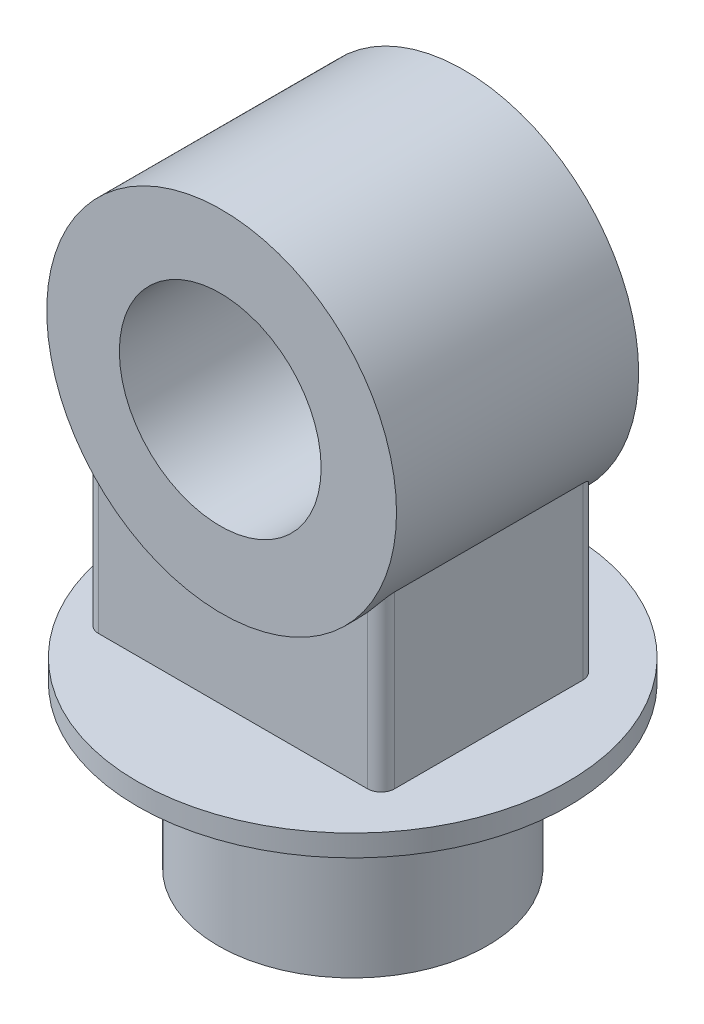
ISO-10303-21;
HEADER;
FILE_DESCRIPTION(('STEP AP214'),'2;1');
FILE_NAME('part.step','',(''),(''),'','','');
FILE_SCHEMA(('AUTOMOTIVE_DESIGN { 1 0 10303 214 1 1 1 1 }'));
ENDSEC;
DATA;
#1=APPLICATION_CONTEXT('core data for automotive mechanical design processes');
#2=APPLICATION_PROTOCOL_DEFINITION('international standard','automotive_design',2000,#1);
#3=PRODUCT_CONTEXT('',#1,'mechanical');
#4=PRODUCT('Part','Part','',(#3));
#5=PRODUCT_RELATED_PRODUCT_CATEGORY('part','',(#4));
#6=PRODUCT_DEFINITION_FORMATION('','',#4);
#7=PRODUCT_DEFINITION_CONTEXT('part definition',#1,'design');
#8=PRODUCT_DEFINITION('design','',#6,#7);
#9=PRODUCT_DEFINITION_SHAPE('','',#8);
#10=(LENGTH_UNIT() NAMED_UNIT(*) SI_UNIT(.MILLI.,.METRE.));
#11=(NAMED_UNIT(*) PLANE_ANGLE_UNIT() SI_UNIT($,.RADIAN.));
#12=(NAMED_UNIT(*) SI_UNIT($,.STERADIAN.) SOLID_ANGLE_UNIT());
#13=UNCERTAINTY_MEASURE_WITH_UNIT(LENGTH_MEASURE(1.E-05),#10,'distance_accuracy_value','');
#14=(GEOMETRIC_REPRESENTATION_CONTEXT(3) GLOBAL_UNCERTAINTY_ASSIGNED_CONTEXT((#13)) GLOBAL_UNIT_ASSIGNED_CONTEXT((#10,
#11,#12)) REPRESENTATION_CONTEXT('',''));
#15=CARTESIAN_POINT('',(0.,0.,0.));
#16=DIRECTION('',(0.,0.,1.));
#17=DIRECTION('',(1.,0.,0.));
#18=AXIS2_PLACEMENT_3D('',#15,#16,#17);
#19=CARTESIAN_POINT('',(0.26168324346057,120.,-0.0361809846551459));
#20=DIRECTION('',(0.,-1.,0.));
#21=DIRECTION('',(0.,0.,-1.));
#22=AXIS2_PLACEMENT_3D('',#19,#20,#21);
#23=CYLINDRICAL_SURFACE('',#22,100.);
#24=CARTESIAN_POINT('',(0.26168324346057,120.,-0.0361809846551459));
#25=DIRECTION('',(0.,1.,0.));
#26=DIRECTION('',(0.,0.,1.));
#27=AXIS2_PLACEMENT_3D('',#24,#25,#26);
#28=CIRCLE('',#27,100.);
#29=CARTESIAN_POINT('',(0.26168324346057,120.,99.9638190153449));
#30=VERTEX_POINT('',#29);
#31=EDGE_CURVE('E140',#30,#30,#28,.T.);
#32=ORIENTED_EDGE('',*,*,#31,.F.);
#33=EDGE_LOOP('',(#32));
#34=FACE_BOUND('',#33,.T.);
#35=CARTESIAN_POINT('',(0.26168324346057,0.,-0.0361809846551459));
#36=DIRECTION('',(0.,1.,0.));
#37=DIRECTION('',(0.,0.,1.));
#38=AXIS2_PLACEMENT_3D('',#35,#36,#37);
#39=CIRCLE('',#38,100.);
#40=CARTESIAN_POINT('',(0.26168324346057,0.,99.9638190153449));
#41=VERTEX_POINT('',#40);
#42=EDGE_CURVE('E209',#41,#41,#39,.T.);
#43=ORIENTED_EDGE('',*,*,#42,.T.);
#44=EDGE_LOOP('',(#43));
#45=FACE_BOUND('',#44,.T.);
#46=ADVANCED_FACE('F39',(#34,#45),#23,.T.);
#47=CARTESIAN_POINT('',(0.26168324346057,0.,-0.0361809846551459));
#48=DIRECTION('',(0.,1.,0.));
#49=DIRECTION('',(0.,0.,1.));
#50=AXIS2_PLACEMENT_3D('',#47,#48,#49);
#51=PLANE('',#50);
#52=ORIENTED_EDGE('',*,*,#42,.F.);
#53=EDGE_LOOP('',(#52));
#54=FACE_BOUND('',#53,.T.);
#55=ADVANCED_FACE('F217',(#54),#51,.F.);
#56=CARTESIAN_POINT('',(0.527861333238733,136.,0.229997105122626));
#57=DIRECTION('',(0.,-1.,0.));
#58=DIRECTION('',(0.,0.,-1.));
#59=AXIS2_PLACEMENT_3D('',#56,#57,#58);
#60=CYLINDRICAL_SURFACE('',#59,160.);
#61=CARTESIAN_POINT('',(0.527861333238733,136.,0.229997105122626));
#62=DIRECTION('',(0.,1.,0.));
#63=DIRECTION('',(0.,0.,1.));
#64=AXIS2_PLACEMENT_3D('',#61,#62,#63);
#65=CIRCLE('',#64,160.);
#66=CARTESIAN_POINT('',(0.527861333238733,136.,160.229997105123));
#67=VERTEX_POINT('',#66);
#68=EDGE_CURVE('E206',#67,#67,#65,.T.);
#69=ORIENTED_EDGE('',*,*,#68,.F.);
#70=EDGE_LOOP('',(#69));
#71=FACE_BOUND('',#70,.T.);
#72=CARTESIAN_POINT('',(0.527861333238733,120.,0.229997105122626));
#73=DIRECTION('',(0.,1.,0.));
#74=DIRECTION('',(0.,0.,1.));
#75=AXIS2_PLACEMENT_3D('',#72,#73,#74);
#76=CIRCLE('',#75,160.);
#77=CARTESIAN_POINT('',(0.527861333238733,120.,160.229997105123));
#78=VERTEX_POINT('',#77);
#79=EDGE_CURVE('E202',#78,#78,#76,.T.);
#80=ORIENTED_EDGE('',*,*,#79,.T.);
#81=EDGE_LOOP('',(#80));
#82=FACE_BOUND('',#81,.T.);
#83=ADVANCED_FACE('F219',(#71,#82),#60,.T.);
#84=CARTESIAN_POINT('',(0.527861333238733,136.,0.229997105122626));
#85=DIRECTION('',(0.,1.,0.));
#86=DIRECTION('',(0.,0.,1.));
#87=AXIS2_PLACEMENT_3D('',#84,#85,#86);
#88=PLANE('',#87);
#89=DIRECTION('',(0.,0.,1.));
#90=VECTOR('',#89,1.);
#91=CARTESIAN_POINT('',(-119.267492370599,136.,79.3782272178331));
#92=LINE('',#91,#90);
#93=CARTESIAN_POINT('',(-119.267492370599,136.,-70.6217727821669));
#94=VERTEX_POINT('',#93);
#95=CARTESIAN_POINT('',(-119.267492370599,136.,69.3782272178331));
#96=VERTEX_POINT('',#95);
#97=EDGE_CURVE('E367',#94,#96,#92,.T.);
#98=ORIENTED_EDGE('',*,*,#97,.F.);
#99=CARTESIAN_POINT('',(-109.267492370599,136.,-70.6217727821669));
#100=DIRECTION('',(0.,1.,0.));
#101=DIRECTION('',(0.,0.,1.));
#102=AXIS2_PLACEMENT_3D('',#99,#100,#101);
#103=CIRCLE('',#102,10.);
#104=CARTESIAN_POINT('',(-109.267492370599,136.,-80.6217727821669));
#105=VERTEX_POINT('',#104);
#106=EDGE_CURVE('E122',#94,#105,#103,.F.);
#107=ORIENTED_EDGE('',*,*,#106,.T.);
#108=DIRECTION('',(-1.,0.,0.));
#109=VECTOR('',#108,1.);
#110=CARTESIAN_POINT('',(100.732507629401,136.,-80.6217727821669));
#111=LINE('',#110,#109);
#112=CARTESIAN_POINT('',(90.7325076294013,136.,-80.6217727821669));
#113=VERTEX_POINT('',#112);
#114=EDGE_CURVE('E364',#113,#105,#111,.T.);
#115=ORIENTED_EDGE('',*,*,#114,.F.);
#116=CARTESIAN_POINT('',(90.7325076294013,136.,-70.6217727821669));
#117=DIRECTION('',(0.,1.,0.));
#118=DIRECTION('',(0.,0.,1.));
#119=AXIS2_PLACEMENT_3D('',#116,#117,#118);
#120=CIRCLE('',#119,10.);
#121=CARTESIAN_POINT('',(100.732507629401,136.,-70.621772782167));
#122=VERTEX_POINT('',#121);
#123=EDGE_CURVE('E60',#113,#122,#120,.F.);
#124=ORIENTED_EDGE('',*,*,#123,.T.);
#125=DIRECTION('',(0.,0.,-1.));
#126=VECTOR('',#125,1.);
#127=CARTESIAN_POINT('',(100.732507629401,136.,79.3782272178331));
#128=LINE('',#127,#126);
#129=CARTESIAN_POINT('',(100.732507629401,136.,69.3782272178331));
#130=VERTEX_POINT('',#129);
#131=EDGE_CURVE('E192',#130,#122,#128,.T.);
#132=ORIENTED_EDGE('',*,*,#131,.F.);
#133=CARTESIAN_POINT('',(90.7325076294013,136.,69.3782272178331));
#134=DIRECTION('',(0.,1.,0.));
#135=DIRECTION('',(0.,0.,1.));
#136=AXIS2_PLACEMENT_3D('',#133,#134,#135);
#137=CIRCLE('',#136,10.);
#138=CARTESIAN_POINT('',(90.7325076294013,136.,79.3782272178331));
#139=VERTEX_POINT('',#138);
#140=EDGE_CURVE('E53',#130,#139,#137,.F.);
#141=ORIENTED_EDGE('',*,*,#140,.T.);
#142=DIRECTION('',(1.,0.,0.));
#143=VECTOR('',#142,1.);
#144=CARTESIAN_POINT('',(100.732507629401,136.,79.3782272178331));
#145=LINE('',#144,#143);
#146=CARTESIAN_POINT('',(-109.267492370599,136.,79.3782272178331));
#147=VERTEX_POINT('',#146);
#148=EDGE_CURVE('E191',#147,#139,#145,.T.);
#149=ORIENTED_EDGE('',*,*,#148,.F.);
#150=CARTESIAN_POINT('',(-109.267492370599,136.,69.3782272178331));
#151=DIRECTION('',(0.,1.,0.));
#152=DIRECTION('',(0.,0.,1.));
#153=AXIS2_PLACEMENT_3D('',#150,#151,#152);
#154=CIRCLE('',#153,10.);
#155=EDGE_CURVE('E123',#147,#96,#154,.F.);
#156=ORIENTED_EDGE('',*,*,#155,.T.);
#157=EDGE_LOOP('',(#98,#107,#115,#124,#132,#141,#149,#156));
#158=FACE_BOUND('',#157,.T.);
#159=ORIENTED_EDGE('',*,*,#68,.T.);
#160=EDGE_LOOP('',(#159));
#161=FACE_BOUND('',#160,.T.);
#162=ADVANCED_FACE('F189',(#158,#161),#88,.T.);
#163=CARTESIAN_POINT('',(0.527861333238733,120.,0.229997105122626));
#164=DIRECTION('',(0.,1.,0.));
#165=DIRECTION('',(0.,0.,1.));
#166=AXIS2_PLACEMENT_3D('',#163,#164,#165);
#167=PLANE('',#166);
#168=ORIENTED_EDGE('',*,*,#31,.T.);
#169=EDGE_LOOP('',(#168));
#170=FACE_BOUND('',#169,.T.);
#171=ORIENTED_EDGE('',*,*,#79,.F.);
#172=EDGE_LOOP('',(#171));
#173=FACE_BOUND('',#172,.T.);
#174=ADVANCED_FACE('F228',(#170,#173),#167,.F.);
#175=CARTESIAN_POINT('',(100.732507629401,465.231832198542,79.3782272178331));
#176=DIRECTION('',(0.,0.,-1.));
#177=DIRECTION('',(-1.,0.,0.));
#178=AXIS2_PLACEMENT_3D('',#175,#176,#177);
#179=PLANE('',#178);
#180=CARTESIAN_POINT('',(-7.1625712417821,335.229832198542,79.3782272178331));
#181=DIRECTION('',(0.,0.,-1.));
#182=DIRECTION('',(-1.,0.,0.));
#183=AXIS2_PLACEMENT_3D('',#180,#181,#182);
#184=CIRCLE('',#183,130.);
#185=CARTESIAN_POINT('',(-109.267492370599,254.765025722181,79.3782272178331));
#186=VERTEX_POINT('',#185);
#187=CARTESIAN_POINT('',(90.7325076294013,249.692977376747,79.3782272178331));
#188=VERTEX_POINT('',#187);
#189=EDGE_CURVE('E115',#186,#188,#184,.F.);
#190=ORIENTED_EDGE('',*,*,#189,.F.);
#191=DIRECTION('',(0.,-1.,0.));
#192=VECTOR('',#191,1.);
#193=CARTESIAN_POINT('',(-109.267492370599,465.231832198542,79.3782272178331));
#194=LINE('',#193,#192);
#195=EDGE_CURVE('E129',#186,#147,#194,.T.);
#196=ORIENTED_EDGE('',*,*,#195,.T.);
#197=ORIENTED_EDGE('',*,*,#148,.T.);
#198=DIRECTION('',(0.,-1.,0.));
#199=VECTOR('',#198,1.);
#200=CARTESIAN_POINT('',(90.7325076294013,465.231832198542,79.3782272178331));
#201=LINE('',#200,#199);
#202=EDGE_CURVE('E131',#139,#188,#201,.F.);
#203=ORIENTED_EDGE('',*,*,#202,.T.);
#204=EDGE_LOOP('',(#190,#196,#197,#203));
#205=FACE_BOUND('',#204,.T.);
#206=ADVANCED_FACE('F127',(#205),#179,.F.);
#207=CARTESIAN_POINT('',(-119.267492370599,465.231832198542,79.3782272178331));
#208=DIRECTION('',(1.,0.,0.));
#209=DIRECTION('',(0.,0.,-1.));
#210=AXIS2_PLACEMENT_3D('',#207,#208,#209);
#211=PLANE('',#210);
#212=ORIENTED_EDGE('',*,*,#97,.T.);
#213=DIRECTION('',(0.,-1.,0.));
#214=VECTOR('',#213,1.);
#215=CARTESIAN_POINT('',(-119.267492370599,465.231832198542,69.3782272178331));
#216=LINE('',#215,#214);
#217=CARTESIAN_POINT('',(-119.267492370599,269.408204607743,69.3782272178331));
#218=VERTEX_POINT('',#217);
#219=EDGE_CURVE('E138',#96,#218,#216,.F.);
#220=ORIENTED_EDGE('',*,*,#219,.T.);
#221=DIRECTION('',(0.,0.,-1.));
#222=VECTOR('',#221,1.);
#223=CARTESIAN_POINT('',(-119.267492370599,269.408204607743,90.));
#224=LINE('',#223,#222);
#225=CARTESIAN_POINT('',(-119.267492370599,269.408204607743,-70.6217727821669));
#226=VERTEX_POINT('',#225);
#227=EDGE_CURVE('E118',#226,#218,#224,.F.);
#228=ORIENTED_EDGE('',*,*,#227,.F.);
#229=DIRECTION('',(0.,-1.,0.));
#230=VECTOR('',#229,1.);
#231=CARTESIAN_POINT('',(-119.267492370599,465.231832198542,-70.6217727821669));
#232=LINE('',#231,#230);
#233=EDGE_CURVE('E135',#226,#94,#232,.T.);
#234=ORIENTED_EDGE('',*,*,#233,.T.);
#235=EDGE_LOOP('',(#212,#220,#228,#234));
#236=FACE_BOUND('',#235,.T.);
#237=ADVANCED_FACE('F234',(#236),#211,.F.);
#238=CARTESIAN_POINT('',(100.732507629401,465.231832198542,79.3782272178331));
#239=DIRECTION('',(-1.,0.,0.));
#240=DIRECTION('',(0.,0.,1.));
#241=AXIS2_PLACEMENT_3D('',#238,#239,#240);
#242=PLANE('',#241);
#243=ORIENTED_EDGE('',*,*,#131,.T.);
#244=DIRECTION('',(0.,-1.,0.));
#245=VECTOR('',#244,1.);
#246=CARTESIAN_POINT('',(100.732507629401,465.231832198542,-70.621772782167));
#247=LINE('',#246,#245);
#248=CARTESIAN_POINT('',(100.732507629401,262.713268881041,-70.6217727821669));
#249=VERTEX_POINT('',#248);
#250=EDGE_CURVE('E152',#122,#249,#247,.F.);
#251=ORIENTED_EDGE('',*,*,#250,.T.);
#252=DIRECTION('',(0.,0.,-1.));
#253=VECTOR('',#252,1.);
#254=CARTESIAN_POINT('',(100.732507629401,262.713268881041,90.));
#255=LINE('',#254,#253);
#256=CARTESIAN_POINT('',(100.732507629401,262.713268881041,69.3782272178331));
#257=VERTEX_POINT('',#256);
#258=EDGE_CURVE('E132',#257,#249,#255,.T.);
#259=ORIENTED_EDGE('',*,*,#258,.F.);
#260=DIRECTION('',(0.,-1.,0.));
#261=VECTOR('',#260,1.);
#262=CARTESIAN_POINT('',(100.732507629401,465.231832198542,69.3782272178331));
#263=LINE('',#262,#261);
#264=EDGE_CURVE('E150',#257,#130,#263,.T.);
#265=ORIENTED_EDGE('',*,*,#264,.T.);
#266=EDGE_LOOP('',(#243,#251,#259,#265));
#267=FACE_BOUND('',#266,.T.);
#268=ADVANCED_FACE('F198',(#267),#242,.F.);
#269=CARTESIAN_POINT('',(100.732507629401,465.231832198542,-80.6217727821669));
#270=DIRECTION('',(0.,0.,1.));
#271=DIRECTION('',(1.,0.,0.));
#272=AXIS2_PLACEMENT_3D('',#269,#270,#271);
#273=PLANE('',#272);
#274=ORIENTED_EDGE('',*,*,#114,.T.);
#275=DIRECTION('',(0.,-1.,0.));
#276=VECTOR('',#275,1.);
#277=CARTESIAN_POINT('',(-109.267492370599,465.231832198542,-80.6217727821669));
#278=LINE('',#277,#276);
#279=CARTESIAN_POINT('',(-109.267492370599,254.765025722181,-80.621772782167));
#280=VERTEX_POINT('',#279);
#281=EDGE_CURVE('E148',#105,#280,#278,.F.);
#282=ORIENTED_EDGE('',*,*,#281,.T.);
#283=CARTESIAN_POINT('',(-7.1625712417821,335.229832198542,-80.621772782167));
#284=DIRECTION('',(0.,0.,1.));
#285=DIRECTION('',(1.,0.,0.));
#286=AXIS2_PLACEMENT_3D('',#283,#284,#285);
#287=CIRCLE('',#286,130.);
#288=CARTESIAN_POINT('',(90.7325076294013,249.692977376747,-80.621772782167));
#289=VERTEX_POINT('',#288);
#290=EDGE_CURVE('E200',#289,#280,#287,.F.);
#291=ORIENTED_EDGE('',*,*,#290,.F.);
#292=DIRECTION('',(0.,-1.,0.));
#293=VECTOR('',#292,1.);
#294=CARTESIAN_POINT('',(90.7325076294013,465.231832198542,-80.6217727821669));
#295=LINE('',#294,#293);
#296=EDGE_CURVE('E145',#289,#113,#295,.T.);
#297=ORIENTED_EDGE('',*,*,#296,.T.);
#298=EDGE_LOOP('',(#274,#282,#291,#297));
#299=FACE_BOUND('',#298,.T.);
#300=ADVANCED_FACE('F238',(#299),#273,.F.);
#301=CARTESIAN_POINT('',(-7.1625712417821,335.229832198542,90.));
#302=DIRECTION('',(0.,0.,-1.));
#303=DIRECTION('',(-1.,0.,0.));
#304=AXIS2_PLACEMENT_3D('',#301,#302,#303);
#305=CYLINDRICAL_SURFACE('',#304,130.);
#306=CARTESIAN_POINT('',(-7.1625712417821,335.229832198542,90.));
#307=DIRECTION('',(0.,0.,1.));
#308=DIRECTION('',(1.,0.,0.));
#309=AXIS2_PLACEMENT_3D('',#306,#307,#308);
#310=CIRCLE('',#309,130.);
#311=CARTESIAN_POINT('',(122.837428758218,335.229832198542,90.));
#312=VERTEX_POINT('',#311);
#313=EDGE_CURVE('E368',#312,#312,#310,.T.);
#314=ORIENTED_EDGE('',*,*,#313,.F.);
#315=EDGE_LOOP('',(#314));
#316=FACE_BOUND('',#315,.T.);
#317=CARTESIAN_POINT('',(-7.1625712417821,335.229832198542,-90.));
#318=DIRECTION('',(0.,0.,1.));
#319=DIRECTION('',(1.,0.,0.));
#320=AXIS2_PLACEMENT_3D('',#317,#318,#319);
#321=CIRCLE('',#320,130.);
#322=CARTESIAN_POINT('',(122.837428758218,335.229832198542,-90.));
#323=VERTEX_POINT('',#322);
#324=EDGE_CURVE('E372',#323,#323,#321,.T.);
#325=ORIENTED_EDGE('',*,*,#324,.T.);
#326=EDGE_LOOP('',(#325));
#327=FACE_BOUND('',#326,.T.);
#328=ORIENTED_EDGE('',*,*,#290,.T.);
#329=CARTESIAN_POINT('',(-109.267492370599,254.765025722181,-80.6217727821669));
#330=CARTESIAN_POINT('',(-109.498900262658,255.058661877432,-80.6217521814497));
#331=CARTESIAN_POINT('',(-109.72902458813,255.353287244784,-80.6137401489048));
#332=CARTESIAN_POINT('',(-110.186313292142,255.943970922768,-80.5821141841533));
#333=CARTESIAN_POINT('',(-110.4134778348,256.240029152692,-80.5585011208002));
#334=CARTESIAN_POINT('',(-110.864713779298,256.833373277592,-80.496021603986));
#335=CARTESIAN_POINT('',(-111.088781730568,257.130660127061,-80.4571393637083));
#336=CARTESIAN_POINT('',(-111.533247033557,257.725639377669,-80.3643547947934));
#337=CARTESIAN_POINT('',(-111.753644328744,258.023331784978,-80.3104522350443));
#338=CARTESIAN_POINT('',(-112.192511752985,258.62140918003,-80.1871637916155));
#339=CARTESIAN_POINT('',(-112.410943702643,258.921792890014,-80.117635727267));
#340=CARTESIAN_POINT('',(-112.843391956407,259.521834634841,-79.9633810910099));
#341=CARTESIAN_POINT('',(-113.057408295637,259.821492675439,-79.878654640049));
#342=CARTESIAN_POINT('',(-113.480561872224,260.419278880946,-79.6938904679674));
#343=CARTESIAN_POINT('',(-113.689701705152,260.717407790638,-79.5938611167531));
#344=CARTESIAN_POINT('',(-114.102811487661,261.311526491415,-79.3781408657023));
#345=CARTESIAN_POINT('',(-114.30678199632,261.607516511332,-79.2624516681859));
#346=CARTESIAN_POINT('',(-114.740103029541,262.24186081388,-78.9958310812714));
#347=CARTESIAN_POINT('',(-114.968529376617,262.579725572788,-78.8422160325002));
#348=CARTESIAN_POINT('',(-115.417104182929,263.249844459353,-78.5122613048293));
#349=CARTESIAN_POINT('',(-115.637252789727,263.582098686967,-78.3359220312684));
#350=CARTESIAN_POINT('',(-116.067732299176,264.238146089981,-77.9592377685597));
#351=CARTESIAN_POINT('',(-116.278082364242,264.561955183419,-77.7589426248545));
#352=CARTESIAN_POINT('',(-116.687899434408,265.198798827694,-77.3318526292036));
#353=CARTESIAN_POINT('',(-116.887370209693,265.511837097066,-77.105067044143));
#354=CARTESIAN_POINT('',(-117.206169956856,266.016668059678,-76.706014709377));
#355=CARTESIAN_POINT('',(-117.329254836846,266.212782340656,-76.5421990610846));
#356=CARTESIAN_POINT('',(-117.56905074812,266.59703745268,-76.2009869744488));
#357=CARTESIAN_POINT('',(-117.685761372287,266.785177774264,-76.0235896703913));
#358=CARTESIAN_POINT('',(-117.911555443021,267.151137460297,-75.6543616866332));
#359=CARTESIAN_POINT('',(-118.020648002503,267.328969111396,-75.4625488421726));
#360=CARTESIAN_POINT('',(-118.229888946827,267.671774238454,-75.0631952756151));
#361=CARTESIAN_POINT('',(-118.330041166431,267.836753223377,-74.8556613680201));
#362=CARTESIAN_POINT('',(-118.488014164341,268.098164812731,-74.4956263309128));
#363=CARTESIAN_POINT('',(-118.548843791065,268.199159974093,-74.3477501158961));
#364=CARTESIAN_POINT('',(-118.664981339939,268.392527865164,-74.0442863166774));
#365=CARTESIAN_POINT('',(-118.720288023244,268.484898660051,-73.8886970140222));
#366=CARTESIAN_POINT('',(-118.824502138679,268.659391941122,-73.5699348637338));
#367=CARTESIAN_POINT('',(-118.873414001331,268.741521520882,-73.4067673738561));
#368=CARTESIAN_POINT('',(-118.963933052619,268.893843863989,-73.0730754687763));
#369=CARTESIAN_POINT('',(-119.005545014664,268.964044426779,-72.9025559526443));
#370=CARTESIAN_POINT('',(-119.073279101215,269.078513238376,-72.5882848746702));
#371=CARTESIAN_POINT('',(-119.100840839208,269.125171683733,-72.44571334997));
#372=CARTESIAN_POINT('',(-119.150066193597,269.208598313193,-72.1567618368583));
#373=CARTESIAN_POINT('',(-119.171732807327,269.24537152326,-72.0103838254628));
#374=CARTESIAN_POINT('',(-119.208684653589,269.308137767955,-71.7148547602362));
#375=CARTESIAN_POINT('',(-119.223982945744,269.334152863697,-71.5657100432202));
#376=CARTESIAN_POINT('',(-119.247892592412,269.374830089357,-71.265407687884));
#377=CARTESIAN_POINT('',(-119.25650825869,269.389499539698,-71.1142514116185));
#378=CARTESIAN_POINT('',(-119.263615990142,269.401602882778,-70.9059324775838));
#379=CARTESIAN_POINT('',(-119.265069459297,269.404078144785,-70.8491206521336));
#380=CARTESIAN_POINT('',(-119.267007347672,269.407378511454,-70.7354658440216));
#381=CARTESIAN_POINT('',(-119.267492332794,269.40820457977,-70.6786228989792));
#382=CARTESIAN_POINT('',(-119.267492370599,269.408204607743,-70.6217727821669));
#383=B_SPLINE_CURVE_WITH_KNOTS('',3,(#329,#330,#331,#332,#333,#334,#335,#336,#337,#338,#339,
#340,#341,#342,#343,#344,#345,#346,#347,#348,#349,#350,#351,#352,#353,#354,#355,#356,#357,#358,
#359,#360,#361,#362,#363,#364,#365,#366,#367,#368,#369,#370,#371,#372,#373,#374,#375,#376,#377,
#378,#379,#380,#381,#382),.UNSPECIFIED.,.F.,.F.,(4,2,2,2,2,2,2,2,2,2,2,2,2,2,2,2,2,2,2,2,2,2,2,
2,2,2,4),(0.,1.1214680348112,2.24287361801551,3.3654416890131,4.48802703349366,5.62127335170905,
6.75451065202904,7.88713033078258,9.01962698563473,10.3263869427175,11.6331235939587,
12.9371871074157,14.2407957919837,15.0912662061706,15.9417908757694,16.7912800517176,
17.6404030895281,18.2074062891999,18.7745363882917,19.3412714566826,19.9076345439821,
20.364768339765,20.8216692728955,21.2776285600471,21.7332934076824,21.9039211613364,
22.0744491849853),.UNSPECIFIED.);
#384=EDGE_CURVE('E176',#280,#226,#383,.T.);
#385=ORIENTED_EDGE('',*,*,#384,.T.);
#386=ORIENTED_EDGE('',*,*,#227,.T.);
#387=CARTESIAN_POINT('',(-119.267492370599,269.408204607743,69.3782272178331));
#388=CARTESIAN_POINT('',(-119.267524323728,269.408263578687,69.532614426514));
#389=CARTESIAN_POINT('',(-119.263918383182,269.402117603407,69.6869668966862));
#390=CARTESIAN_POINT('',(-119.24967595752,269.377867062783,69.9942355512236));
#391=CARTESIAN_POINT('',(-119.239047293552,269.359775800819,70.1471531416767));
#392=CARTESIAN_POINT('',(-119.21115769371,269.312346093652,70.4488676043652));
#393=CARTESIAN_POINT('',(-119.19397089223,269.283133375598,70.5976912896824));
#394=CARTESIAN_POINT('',(-119.153363169143,269.214196695535,70.8920422058182));
#395=CARTESIAN_POINT('',(-119.129940213779,269.174469304468,71.0375683443984));
#396=CARTESIAN_POINT('',(-119.070797468666,269.074310378548,71.3602420817229));
#397=CARTESIAN_POINT('',(-119.033468335143,269.011187118836,71.536261008009));
#398=CARTESIAN_POINT('',(-118.95082441845,268.87176552052,71.8811394573298));
#399=CARTESIAN_POINT('',(-118.905503846407,268.795457631991,72.0499936796097));
#400=CARTESIAN_POINT('',(-118.807680307545,268.631192671841,72.3806715238303));
#401=CARTESIAN_POINT('',(-118.755148062073,268.543188162067,72.5424627478756));
#402=CARTESIAN_POINT('',(-118.643979191671,268.357510535399,72.8580963879468));
#403=CARTESIAN_POINT('',(-118.585343907019,268.259839541574,73.0119405381572));
#404=CARTESIAN_POINT('',(-118.42744223556,267.997671503304,73.3982438386572));
#405=CARTESIAN_POINT('',(-118.324220685085,267.827078329547,73.6249633247394));
#406=CARTESIAN_POINT('',(-118.107066993702,267.470238253357,74.0602279325609));
#407=CARTESIAN_POINT('',(-117.993128435437,267.283981979005,74.2687620189904));
#408=CARTESIAN_POINT('',(-117.756300729584,266.89917942617,74.6691905002229));
#409=CARTESIAN_POINT('',(-117.633400625798,266.700618149904,74.8610638765155));
#410=CARTESIAN_POINT('',(-117.380132052949,266.294016391954,75.2292980003256));
#411=CARTESIAN_POINT('',(-117.249760798757,266.085972381246,75.4056528998567));
#412=CARTESIAN_POINT('',(-116.997133858983,265.685467372124,75.7256323113449));
#413=CARTESIAN_POINT('',(-116.875532756183,265.493765289,75.8707318777931));
#414=CARTESIAN_POINT('',(-116.62785388354,265.10562137133,76.1502219685567));
#415=CARTESIAN_POINT('',(-116.501777047958,264.90918052866,76.2846147090251));
#416=CARTESIAN_POINT('',(-116.117288666881,264.313737283107,76.6729695301042));
#417=CARTESIAN_POINT('',(-115.85275816894,263.908834820713,76.9119352348164));
#418=CARTESIAN_POINT('',(-115.309487888626,263.087696622517,77.3542668440826));
#419=CARTESIAN_POINT('',(-115.030713223108,262.671434353567,77.5575393563414));
#420=CARTESIAN_POINT('',(-114.461271191777,261.831969015238,77.9304469333471));
#421=CARTESIAN_POINT('',(-114.170601505096,261.408764601102,78.1000753956005));
#422=CARTESIAN_POINT('',(-113.514589439077,260.465899534701,78.4406129615402));
#423=CARTESIAN_POINT('',(-113.146719513799,259.945217653435,78.6038276806775));
#424=CARTESIAN_POINT('',(-112.397282008343,258.901143941915,78.8842493153346));
#425=CARTESIAN_POINT('',(-112.015711581087,258.377751567963,79.0014466069516));
#426=CARTESIAN_POINT('',(-111.436698568404,257.596011175292,79.1421078666377));
#427=CARTESIAN_POINT('',(-111.243673166219,257.337414058132,79.1830076786959));
#428=CARTESIAN_POINT('',(-110.854945356628,256.82067435663,79.2533988471049));
#429=CARTESIAN_POINT('',(-110.65924305409,256.562531754926,79.2828906490547));
#430=CARTESIAN_POINT('',(-110.265462641623,256.0471390388,79.3302813843184));
#431=CARTESIAN_POINT('',(-110.067385381742,255.789888645179,79.348184346388));
#432=CARTESIAN_POINT('',(-109.669026044302,255.276518079373,79.3721518238783));
#433=CARTESIAN_POINT('',(-109.468743807862,255.020397990522,79.3782154805176));
#434=CARTESIAN_POINT('',(-109.267492370599,254.765025722181,79.3782272178331));
#435=B_SPLINE_CURVE_WITH_KNOTS('',3,(#387,#388,#389,#390,#391,#392,#393,#394,#395,#396,#397,
#398,#399,#400,#401,#402,#403,#404,#405,#406,#407,#408,#409,#410,#411,#412,#413,#414,#415,#416,
#417,#418,#419,#420,#421,#422,#423,#424,#425,#426,#427,#428,#429,#430,#431,#432,#433,#434),
.UNSPECIFIED.,.F.,.F.,(4,2,2,2,2,2,2,2,2,2,2,2,2,2,2,2,2,2,2,2,2,2,2,4),(0.,0.462941850770554,
0.925368994180368,1.38271662305813,1.84021358685788,2.41139898244624,2.98299984837969,
3.55699404732277,4.13086245736633,5.03516327312745,5.94000907497817,6.84598029512504,
7.75229147254309,8.56025176285601,9.36804438059978,10.9845650564991,12.6052543438659,
14.2262613701981,16.198682754904,18.1715164245851,19.1471705354496,20.1227865332342,
21.0980631845084,22.0734105762848),.UNSPECIFIED.);
#436=EDGE_CURVE('E111',#218,#186,#435,.T.);
#437=ORIENTED_EDGE('',*,*,#436,.T.);
#438=ORIENTED_EDGE('',*,*,#189,.T.);
#439=CARTESIAN_POINT('',(90.7325076294013,249.692977376747,79.3782272178331));
#440=CARTESIAN_POINT('',(90.9492036203172,249.940976876005,79.3782132067025));
#441=CARTESIAN_POINT('',(91.1649422197808,250.189791347056,79.3711835076914));
#442=CARTESIAN_POINT('',(91.5941388573237,250.68859807102,79.343361860051));
#443=CARTESIAN_POINT('',(91.807596995614,250.938590271478,79.3225705187025));
#444=CARTESIAN_POINT('',(92.2320661333001,251.439534703696,79.2674712966771));
#445=CARTESIAN_POINT('',(92.4430749024897,251.690487570085,79.2331519615655));
#446=CARTESIAN_POINT('',(92.862107448325,252.19266765922,79.1511682955734));
#447=CARTESIAN_POINT('',(93.0701311860518,252.443894885497,79.1035037908641));
#448=CARTESIAN_POINT('',(93.6936423061533,253.202671474539,78.9394940209061));
#449=CARTESIAN_POINT('',(94.1041711457123,253.710123048079,78.8027034391767));
#450=CARTESIAN_POINT('',(94.7076005799741,254.467386895881,78.5567749548075));
#451=CARTESIAN_POINT('',(94.9066616420826,254.719128154581,78.4680204899478));
#452=CARTESIAN_POINT('',(95.3003762746762,255.220795460549,78.276681215741));
#453=CARTESIAN_POINT('',(95.4950302074629,255.470721655874,78.1740975481232));
#454=CARTESIAN_POINT('',(95.9417826439554,256.048614106714,77.9192657278891));
#455=CARTESIAN_POINT('',(96.1920744371356,256.375647705496,77.7616913785458));
#456=CARTESIAN_POINT('',(96.6830761345029,257.02339604517,77.420621090897));
#457=CARTESIAN_POINT('',(96.9237858565762,257.344110665906,77.237124660226));
#458=CARTESIAN_POINT('',(97.3934249402874,257.975718681981,76.843202346376));
#459=CARTESIAN_POINT('',(97.6223878337332,258.286638927241,76.6328598724784));
#460=CARTESIAN_POINT('',(98.0672802700413,258.896219219758,76.1827286573134));
#461=CARTESIAN_POINT('',(98.2832156481391,259.19488473664,75.9429532477966));
#462=CARTESIAN_POINT('',(98.6202507813493,259.665000741316,75.5284522936414));
#463=CARTESIAN_POINT('',(98.7462249474928,259.841691481847,75.3636010105597));
#464=CARTESIAN_POINT('',(98.9911773139037,260.187001648265,75.0208120262819));
#465=CARTESIAN_POINT('',(99.11015736069,260.355623202295,74.8428778072907));
#466=CARTESIAN_POINT('',(99.340004564391,260.682925438614,74.4731596098348));
#467=CARTESIAN_POINT('',(99.4508737268547,260.841608576933,74.28137907856));
#468=CARTESIAN_POINT('',(99.6630407937383,261.146614306473,73.8833884267365));
#469=CARTESIAN_POINT('',(99.7643416046217,261.292940649729,73.6771827212928));
#470=CARTESIAN_POINT('',(100.000476250173,261.635388421683,73.1495302985554));
#471=CARTESIAN_POINT('',(100.128868952252,261.822839954078,72.8192479429188));
#472=CARTESIAN_POINT('',(100.297594988464,262.070261777906,72.3009038496631));
#473=CARTESIAN_POINT('',(100.349804726156,262.147027879477,72.1245588322139));
#474=CARTESIAN_POINT('',(100.445381435166,262.287829708052,71.7645842697201));
#475=CARTESIAN_POINT('',(100.488753996671,262.351873482252,71.5809594181062));
#476=CARTESIAN_POINT('',(100.56019156905,262.457517016891,71.2338698503213));
#477=CARTESIAN_POINT('',(100.589556032345,262.501012939037,71.0712487017648));
#478=CARTESIAN_POINT('',(100.64045222553,262.576475834839,70.7421734718061));
#479=CARTESIAN_POINT('',(100.661986222132,262.608446144831,70.5757205144697));
#480=CARTESIAN_POINT('',(100.696910172635,262.660325374787,70.2382798272295));
#481=CARTESIAN_POINT('',(100.710212479898,262.680104480822,70.0672628627915));
#482=CARTESIAN_POINT('',(100.728035534971,262.706615089195,69.7235869347364));
#483=CARTESIAN_POINT('',(100.732546813494,262.713332522092,69.5509264016151));
#484=CARTESIAN_POINT('',(100.732507629401,262.713268881041,69.3782272178331));
#485=B_SPLINE_CURVE_WITH_KNOTS('',3,(#439,#440,#441,#442,#443,#444,#445,#446,#447,#448,#449,
#450,#451,#452,#453,#454,#455,#456,#457,#458,#459,#460,#461,#462,#463,#464,#465,#466,#467,#468,
#469,#470,#471,#472,#473,#474,#475,#476,#477,#478,#479,#480,#481,#482,#483,#484),.UNSPECIFIED.,
.F.,.F.,(4,2,2,2,2,2,2,2,2,2,2,2,2,2,2,2,2,2,2,2,2,2,4),(0.,0.987899457113308,1.97575532259569,
2.96444942920928,3.95315641474783,5.95099851007153,6.94969750628299,7.94831410104656,
9.27026078113096,10.5922325737303,11.910192739789,13.2275581189058,14.0446661389299,
14.8615574561689,15.6782460961057,16.4946858571204,17.6925160682581,18.2898017100626,
18.8867083420469,19.3987853245465,19.9107139561107,20.4280035485608,20.9458500338888),.UNSPECIFIED.);
#486=EDGE_CURVE('E11',#188,#257,#485,.T.);
#487=ORIENTED_EDGE('',*,*,#486,.T.);
#488=ORIENTED_EDGE('',*,*,#258,.T.);
#489=CARTESIAN_POINT('',(100.732507629401,262.713268881041,-70.6217727821669));
#490=CARTESIAN_POINT('',(100.732542868259,262.713326108593,-70.7897776998855));
#491=CARTESIAN_POINT('',(100.728275256845,262.706971756748,-70.9577487949577));
#492=CARTESIAN_POINT('',(100.711403987212,262.681876467766,-71.2921759683122));
#493=CARTESIAN_POINT('',(100.698808763759,262.663148063914,-71.4586334069643));
#494=CARTESIAN_POINT('',(100.665719167784,262.613989569614,-71.7872600446754));
#495=CARTESIAN_POINT('',(100.645306001104,262.583679783506,-71.9494555904323));
#496=CARTESIAN_POINT('',(100.597023917462,262.512079732627,-72.2702997870619));
#497=CARTESIAN_POINT('',(100.569152753925,262.470786159229,-72.4289473535463));
#498=CARTESIAN_POINT('',(100.499200564811,262.367306577719,-72.7782468825655));
#499=CARTESIAN_POINT('',(100.455322333919,262.302495223181,-72.9677632064848));
#500=CARTESIAN_POINT('',(100.358131690328,262.159277775932,-73.3391722692207));
#501=CARTESIAN_POINT('',(100.30481270156,262.080862207822,-73.5210595840153));
#502=CARTESIAN_POINT('',(100.189641802424,261.911943309296,-73.8771949532393));
#503=CARTESIAN_POINT('',(100.127758381646,261.82139538239,-74.051411512637));
#504=CARTESIAN_POINT('',(99.9966658216923,261.630162613049,-74.3911935624392));
#505=CARTESIAN_POINT('',(99.9274583924887,261.529480137042,-74.5567610587581));
#506=CARTESIAN_POINT('',(99.7456199646641,261.26581600276,-74.9617226202932));
#507=CARTESIAN_POINT('',(99.6288582692875,261.097270790743,-75.1956535209737));
#508=CARTESIAN_POINT('',(99.383246976813,260.744700409271,-75.6447474154158));
#509=CARTESIAN_POINT('',(99.2543911001122,260.560667203244,-75.8599005461506));
#510=CARTESIAN_POINT('',(98.9864318330291,260.180226338203,-76.2727348320062));
#511=CARTESIAN_POINT('',(98.8473140194872,259.98380132082,-76.4703905023376));
#512=CARTESIAN_POINT('',(98.5605586792635,259.581428845587,-76.8489695957117));
#513=CARTESIAN_POINT('',(98.4129216385704,259.375481931057,-77.0298939716801));
#514=CARTESIAN_POINT('',(98.0123934889918,258.820357943799,-77.4881260006036));
#515=CARTESIAN_POINT('',(97.7531814869872,258.464688129631,-77.7520951242278));
#516=CARTESIAN_POINT('',(97.2185618100772,257.739300186926,-78.2416469697703));
#517=CARTESIAN_POINT('',(96.94314411176,257.369573415094,-78.4672055912911));
#518=CARTESIAN_POINT('',(96.3781657000207,256.619803546426,-78.8831174243623));
#519=CARTESIAN_POINT('',(96.0885753661278,256.239739651464,-79.0733925432288));
#520=CARTESIAN_POINT('',(95.4977949359169,255.473432178656,-79.4200275742976));
#521=CARTESIAN_POINT('',(95.1966069047296,255.087189708086,-79.5763934919185));
#522=CARTESIAN_POINT('',(94.5615316155786,254.282388930259,-79.8667322701211));
#523=CARTESIAN_POINT('',(94.226868777662,253.863543508339,-79.9982116939034));
#524=CARTESIAN_POINT('',(93.5474208382708,253.024058649815,-80.2240866518005));
#525=CARTESIAN_POINT('',(93.2026349177407,252.603419070414,-80.3184791762901));
#526=CARTESIAN_POINT('',(92.507422135952,251.766152395097,-80.4693655583261));
#527=CARTESIAN_POINT('',(92.1570693409634,251.349521917319,-80.5261785318121));
#528=CARTESIAN_POINT('',(91.6264257615611,250.726527074107,-80.5833261347823));
#529=CARTESIAN_POINT('',(91.4486934170759,250.519188698679,-80.5976966905796));
#530=CARTESIAN_POINT('',(91.0916998471654,250.105376750243,-80.6169170010168));
#531=CARTESIAN_POINT('',(90.9124385664004,249.898903208943,-80.6217664095591));
#532=CARTESIAN_POINT('',(90.7325076294013,249.692977376747,-80.6217727821669));
#533=B_SPLINE_CURVE_WITH_KNOTS('',3,(#489,#490,#491,#492,#493,#494,#495,#496,#497,#498,#499,
#500,#501,#502,#503,#504,#505,#506,#507,#508,#509,#510,#511,#512,#513,#514,#515,#516,#517,#518,
#519,#520,#521,#522,#523,#524,#525,#526,#527,#528,#529,#530,#531,#532),.UNSPECIFIED.,.F.,.F.,(4,
2,2,2,2,2,2,2,2,2,2,2,2,2,2,2,2,2,2,2,2,4),(0.,0.503786529076333,1.0070635693927,
1.50524889523631,2.00358445887717,2.61779220590658,3.23242948177015,3.8493914330328,
4.4662096556828,5.39793328167464,6.33014338683216,7.26368963941865,8.19718268937607,
9.73438767758794,11.2725536485437,12.8140844220034,14.3553419624894,16.0099776680263,
17.6647476205711,19.3052788569481,20.1255331332167,20.945817225512),.UNSPECIFIED.);
#534=EDGE_CURVE('E183',#249,#289,#533,.T.);
#535=ORIENTED_EDGE('',*,*,#534,.T.);
#536=EDGE_LOOP('',(#328,#385,#386,#437,#438,#487,#488,#535));
#537=FACE_BOUND('',#536,.T.);
#538=ADVANCED_FACE('F114',(#316,#327,#537),#305,.T.);
#539=CARTESIAN_POINT('',(-7.1625712417821,335.229832198542,90.));
#540=DIRECTION('',(0.,0.,1.));
#541=DIRECTION('',(1.,0.,0.));
#542=AXIS2_PLACEMENT_3D('',#539,#540,#541);
#543=PLANE('',#542);
#544=ORIENTED_EDGE('',*,*,#313,.T.);
#545=EDGE_LOOP('',(#544));
#546=FACE_BOUND('',#545,.T.);
#547=CARTESIAN_POINT('',(-8.19420200158616,336.,90.));
#548=DIRECTION('',(0.,0.,1.));
#549=DIRECTION('',(1.,0.,0.));
#550=AXIS2_PLACEMENT_3D('',#547,#548,#549);
#551=CIRCLE('',#550,75.);
#552=CARTESIAN_POINT('',(-83.1942020015862,336.,90.));
#553=VERTEX_POINT('',#552);
#554=EDGE_CURVE('E377',#553,#553,#551,.T.);
#555=ORIENTED_EDGE('',*,*,#554,.F.);
#556=EDGE_LOOP('',(#555));
#557=FACE_BOUND('',#556,.T.);
#558=ADVANCED_FACE('F267',(#546,#557),#543,.T.);
#559=CARTESIAN_POINT('',(-7.1625712417821,335.229832198542,-90.));
#560=DIRECTION('',(0.,0.,1.));
#561=DIRECTION('',(1.,0.,0.));
#562=AXIS2_PLACEMENT_3D('',#559,#560,#561);
#563=PLANE('',#562);
#564=ORIENTED_EDGE('',*,*,#324,.F.);
#565=EDGE_LOOP('',(#564));
#566=FACE_BOUND('',#565,.T.);
#567=CARTESIAN_POINT('',(-8.19420200158616,336.,-90.));
#568=DIRECTION('',(0.,0.,1.));
#569=DIRECTION('',(1.,0.,0.));
#570=AXIS2_PLACEMENT_3D('',#567,#568,#569);
#571=CIRCLE('',#570,75.);
#572=CARTESIAN_POINT('',(-83.1942020015862,336.,-90.));
#573=VERTEX_POINT('',#572);
#574=EDGE_CURVE('E379',#573,#573,#571,.T.);
#575=ORIENTED_EDGE('',*,*,#574,.T.);
#576=EDGE_LOOP('',(#575));
#577=FACE_BOUND('',#576,.T.);
#578=ADVANCED_FACE('F275',(#566,#577),#563,.F.);
#579=CARTESIAN_POINT('',(-8.19420200158616,336.,90.));
#580=DIRECTION('',(0.,0.,-1.));
#581=DIRECTION('',(-1.,0.,0.));
#582=AXIS2_PLACEMENT_3D('',#579,#580,#581);
#583=CYLINDRICAL_SURFACE('',#582,75.);
#584=CARTESIAN_POINT('',(-83.1942020015862,336.,90.));
#585=CARTESIAN_POINT('',(-83.1942020015862,336.,88.125));
#586=CARTESIAN_POINT('',(-83.1942020015862,336.,86.25));
#587=CARTESIAN_POINT('',(-83.1942020015862,336.,82.5));
#588=CARTESIAN_POINT('',(-83.1942020015862,336.,80.625));
#589=CARTESIAN_POINT('',(-83.1942020015862,336.,76.875));
#590=CARTESIAN_POINT('',(-83.1942020015862,336.,75.));
#591=CARTESIAN_POINT('',(-83.1942020015862,336.,71.25));
#592=CARTESIAN_POINT('',(-83.1942020015862,336.,69.375));
#593=CARTESIAN_POINT('',(-83.1942020015862,336.,65.625));
#594=CARTESIAN_POINT('',(-83.1942020015862,336.,63.75));
#595=CARTESIAN_POINT('',(-83.1942020015862,336.,60.));
#596=CARTESIAN_POINT('',(-83.1942020015862,336.,58.125));
#597=CARTESIAN_POINT('',(-83.1942020015862,336.,54.375));
#598=CARTESIAN_POINT('',(-83.1942020015862,336.,52.5));
#599=CARTESIAN_POINT('',(-83.1942020015862,336.,48.75));
#600=CARTESIAN_POINT('',(-83.1942020015862,336.,46.875));
#601=CARTESIAN_POINT('',(-83.1942020015862,336.,43.125));
#602=CARTESIAN_POINT('',(-83.1942020015862,336.,41.25));
#603=CARTESIAN_POINT('',(-83.1942020015862,336.,37.5));
#604=CARTESIAN_POINT('',(-83.1942020015862,336.,35.625));
#605=CARTESIAN_POINT('',(-83.1942020015862,336.,31.875));
#606=CARTESIAN_POINT('',(-83.1942020015862,336.,30.));
#607=CARTESIAN_POINT('',(-83.1942020015862,336.,26.25));
#608=CARTESIAN_POINT('',(-83.1942020015862,336.,24.375));
#609=CARTESIAN_POINT('',(-83.1942020015862,336.,20.625));
#610=CARTESIAN_POINT('',(-83.1942020015862,336.,18.75));
#611=CARTESIAN_POINT('',(-83.1942020015862,336.,15.));
#612=CARTESIAN_POINT('',(-83.1942020015862,336.,13.125));
#613=CARTESIAN_POINT('',(-83.1942020015862,336.,9.37499999999998));
#614=CARTESIAN_POINT('',(-83.1942020015862,336.,7.49999999999998));
#615=CARTESIAN_POINT('',(-83.1942020015862,336.,3.74999999999998));
#616=CARTESIAN_POINT('',(-83.1942020015862,336.,1.87499999999997));
#617=CARTESIAN_POINT('',(-83.1942020015862,336.,-1.87500000000003));
#618=CARTESIAN_POINT('',(-83.1942020015862,336.,-3.75000000000003));
#619=CARTESIAN_POINT('',(-83.1942020015862,336.,-7.50000000000003));
#620=CARTESIAN_POINT('',(-83.1942020015862,336.,-9.37500000000004));
#621=CARTESIAN_POINT('',(-83.1942020015862,336.,-13.125));
#622=CARTESIAN_POINT('',(-83.1942020015862,336.,-15.));
#623=CARTESIAN_POINT('',(-83.1942020015862,336.,-18.75));
#624=CARTESIAN_POINT('',(-83.1942020015862,336.,-20.625));
#625=CARTESIAN_POINT('',(-83.1942020015862,336.,-24.375));
#626=CARTESIAN_POINT('',(-83.1942020015862,336.,-26.25));
#627=CARTESIAN_POINT('',(-83.1942020015862,336.,-30.));
#628=CARTESIAN_POINT('',(-83.1942020015862,336.,-31.875));
#629=CARTESIAN_POINT('',(-83.1942020015862,336.,-35.625));
#630=CARTESIAN_POINT('',(-83.1942020015862,336.,-37.5));
#631=CARTESIAN_POINT('',(-83.1942020015862,336.,-41.25));
#632=CARTESIAN_POINT('',(-83.1942020015862,336.,-43.125));
#633=CARTESIAN_POINT('',(-83.1942020015862,336.,-46.875));
#634=CARTESIAN_POINT('',(-83.1942020015862,336.,-48.75));
#635=CARTESIAN_POINT('',(-83.1942020015862,336.,-52.5));
#636=CARTESIAN_POINT('',(-83.1942020015862,336.,-54.375));
#637=CARTESIAN_POINT('',(-83.1942020015862,336.,-58.125));
#638=CARTESIAN_POINT('',(-83.1942020015862,336.,-60.));
#639=CARTESIAN_POINT('',(-83.1942020015862,336.,-63.75));
#640=CARTESIAN_POINT('',(-83.1942020015862,336.,-65.625));
#641=CARTESIAN_POINT('',(-83.1942020015862,336.,-69.375));
#642=CARTESIAN_POINT('',(-83.1942020015862,336.,-71.25));
#643=CARTESIAN_POINT('',(-83.1942020015862,336.,-75.));
#644=CARTESIAN_POINT('',(-83.1942020015862,336.,-76.875));
#645=CARTESIAN_POINT('',(-83.1942020015862,336.,-80.625));
#646=CARTESIAN_POINT('',(-83.1942020015862,336.,-82.5));
#647=CARTESIAN_POINT('',(-83.1942020015862,336.,-86.25));
#648=CARTESIAN_POINT('',(-83.1942020015862,336.,-88.125));
#649=CARTESIAN_POINT('',(-83.1942020015862,336.,-90.));
#650=B_SPLINE_CURVE_WITH_KNOTS('',3,(#584,#585,#586,#587,#588,#589,#590,#591,#592,#593,#594,
#595,#596,#597,#598,#599,#600,#601,#602,#603,#604,#605,#606,#607,#608,#609,#610,#611,#612,#613,
#614,#615,#616,#617,#618,#619,#620,#621,#622,#623,#624,#625,#626,#627,#628,#629,#630,#631,#632,
#633,#634,#635,#636,#637,#638,#639,#640,#641,#642,#643,#644,#645,#646,#647,#648,#649),
.UNSPECIFIED.,.F.,.F.,(4,2,2,2,2,2,2,2,2,2,2,2,2,2,2,2,2,2,2,2,2,2,2,2,2,2,2,2,2,2,2,2,4),(0.,
5.62499999999999,11.25,16.875,22.5,28.125,33.75,39.375,45.,50.625,56.25,61.875,67.5,73.125,
78.75,84.375,90.,95.625,101.25,106.875,112.5,118.125,123.75,129.375,135.,140.625,146.25,151.875,
157.5,163.125,168.75,174.375,180.),.UNSPECIFIED.);
#651=EDGE_CURVE('BSEAM169',#553,#573,#650,.T.);
#652=ORIENTED_EDGE('',*,*,#554,.T.);
#653=ORIENTED_EDGE('',*,*,#574,.F.);
#654=ORIENTED_EDGE('',*,*,#651,.T.);
#655=ORIENTED_EDGE('',*,*,#651,.F.);
#656=EDGE_LOOP('',(#652,#654,#653,#655));
#657=FACE_BOUND('',#656,.T.);
#658=ADVANCED_FACE('F169',(#657),#583,.F.);
#659=CARTESIAN_POINT('',(-109.267492370599,465.231832198542,69.3782272178331));
#660=DIRECTION('',(0.,-1.,0.));
#661=DIRECTION('',(0.,0.,-1.));
#662=AXIS2_PLACEMENT_3D('',#659,#660,#661);
#663=CYLINDRICAL_SURFACE('',#662,10.);
#664=ORIENTED_EDGE('',*,*,#436,.F.);
#665=ORIENTED_EDGE('',*,*,#219,.F.);
#666=ORIENTED_EDGE('',*,*,#155,.F.);
#667=ORIENTED_EDGE('',*,*,#195,.F.);
#668=EDGE_LOOP('',(#664,#665,#666,#667));
#669=FACE_BOUND('',#668,.T.);
#670=ADVANCED_FACE('F134',(#669),#663,.T.);
#671=CARTESIAN_POINT('',(-109.267492370599,465.231832198542,-70.6217727821669));
#672=DIRECTION('',(0.,-1.,0.));
#673=DIRECTION('',(0.,0.,-1.));
#674=AXIS2_PLACEMENT_3D('',#671,#672,#673);
#675=CYLINDRICAL_SURFACE('',#674,10.);
#676=ORIENTED_EDGE('',*,*,#384,.F.);
#677=ORIENTED_EDGE('',*,*,#281,.F.);
#678=ORIENTED_EDGE('',*,*,#106,.F.);
#679=ORIENTED_EDGE('',*,*,#233,.F.);
#680=EDGE_LOOP('',(#676,#677,#678,#679));
#681=FACE_BOUND('',#680,.T.);
#682=ADVANCED_FACE('F168',(#681),#675,.T.);
#683=CARTESIAN_POINT('',(90.7325076294013,465.231832198542,-70.6217727821669));
#684=DIRECTION('',(0.,-1.,0.));
#685=DIRECTION('',(0.,0.,-1.));
#686=AXIS2_PLACEMENT_3D('',#683,#684,#685);
#687=CYLINDRICAL_SURFACE('',#686,10.);
#688=ORIENTED_EDGE('',*,*,#534,.F.);
#689=ORIENTED_EDGE('',*,*,#250,.F.);
#690=ORIENTED_EDGE('',*,*,#123,.F.);
#691=ORIENTED_EDGE('',*,*,#296,.F.);
#692=EDGE_LOOP('',(#688,#689,#690,#691));
#693=FACE_BOUND('',#692,.T.);
#694=ADVANCED_FACE('F173',(#693),#687,.T.);
#695=CARTESIAN_POINT('',(90.7325076294013,465.231832198542,69.3782272178331));
#696=DIRECTION('',(0.,-1.,0.));
#697=DIRECTION('',(0.,0.,-1.));
#698=AXIS2_PLACEMENT_3D('',#695,#696,#697);
#699=CYLINDRICAL_SURFACE('',#698,10.);
#700=ORIENTED_EDGE('',*,*,#486,.F.);
#701=ORIENTED_EDGE('',*,*,#202,.F.);
#702=ORIENTED_EDGE('',*,*,#140,.F.);
#703=ORIENTED_EDGE('',*,*,#264,.F.);
#704=EDGE_LOOP('',(#700,#701,#702,#703));
#705=FACE_BOUND('',#704,.T.);
#706=ADVANCED_FACE('F41',(#705),#699,.T.);
#707=CLOSED_SHELL('',(#46,#55,#83,#162,#174,#206,#237,#268,#300,#538,#558,#578,#658,#670,#682,
#694,#706));
#708=MANIFOLD_SOLID_BREP('B2',#707);
#709=ADVANCED_BREP_SHAPE_REPRESENTATION('',(#18,#708),#14);
#710=SHAPE_DEFINITION_REPRESENTATION(#9,#709);
ENDSEC;
END-ISO-10303-21;
